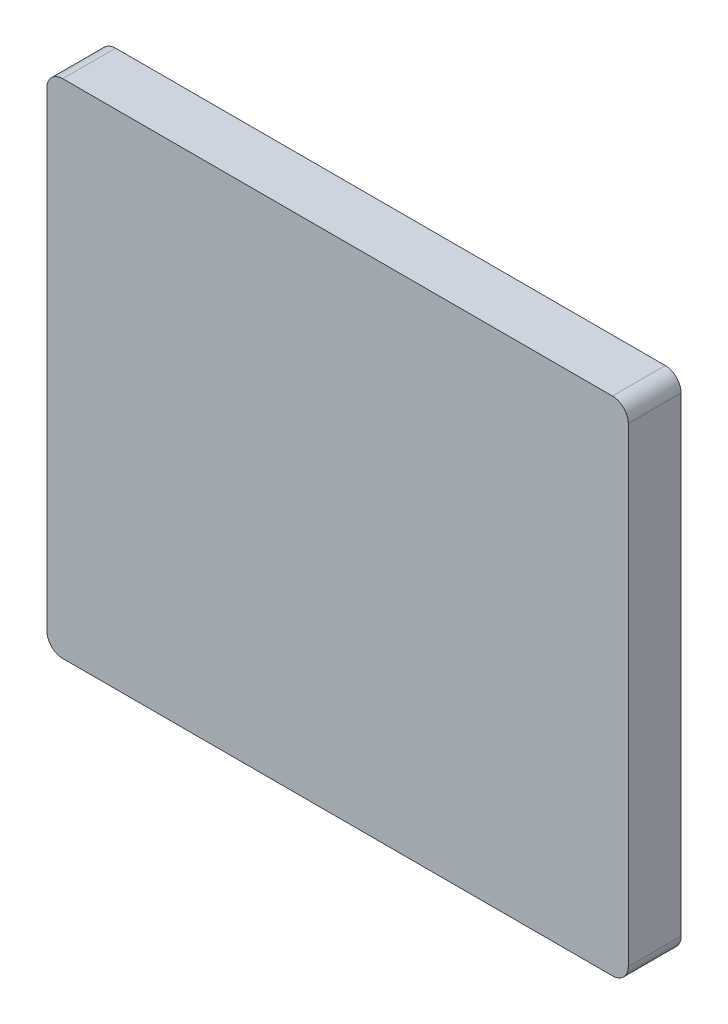
ISO-10303-21;
HEADER;
FILE_DESCRIPTION(('STEP AP214'),'2;1');
FILE_NAME('part.step','',(''),(''),'','','');
FILE_SCHEMA(('AUTOMOTIVE_DESIGN { 1 0 10303 214 1 1 1 1 }'));
ENDSEC;
DATA;
#1=APPLICATION_CONTEXT('core data for automotive mechanical design processes');
#2=APPLICATION_PROTOCOL_DEFINITION('international standard','automotive_design',2000,#1);
#3=PRODUCT_CONTEXT('',#1,'mechanical');
#4=PRODUCT('Part','Part','',(#3));
#5=PRODUCT_RELATED_PRODUCT_CATEGORY('part','',(#4));
#6=PRODUCT_DEFINITION_FORMATION('','',#4);
#7=PRODUCT_DEFINITION_CONTEXT('part definition',#1,'design');
#8=PRODUCT_DEFINITION('design','',#6,#7);
#9=PRODUCT_DEFINITION_SHAPE('','',#8);
#10=(LENGTH_UNIT() NAMED_UNIT(*) SI_UNIT(.MILLI.,.METRE.));
#11=(NAMED_UNIT(*) PLANE_ANGLE_UNIT() SI_UNIT($,.RADIAN.));
#12=(NAMED_UNIT(*) SI_UNIT($,.STERADIAN.) SOLID_ANGLE_UNIT());
#13=UNCERTAINTY_MEASURE_WITH_UNIT(LENGTH_MEASURE(1.E-05),#10,'distance_accuracy_value','');
#14=(GEOMETRIC_REPRESENTATION_CONTEXT(3) GLOBAL_UNCERTAINTY_ASSIGNED_CONTEXT((#13)) GLOBAL_UNIT_ASSIGNED_CONTEXT((#10,
#11,#12)) REPRESENTATION_CONTEXT('',''));
#15=CARTESIAN_POINT('',(0.,0.,0.));
#16=DIRECTION('',(0.,0.,1.));
#17=DIRECTION('',(1.,0.,0.));
#18=AXIS2_PLACEMENT_3D('',#15,#16,#17);
#19=CARTESIAN_POINT('',(-77.5181598062954,47.3849878934625,-10.));
#20=DIRECTION('',(-1.,0.,0.));
#21=DIRECTION('',(0.,0.,1.));
#22=AXIS2_PLACEMENT_3D('',#19,#20,#21);
#23=PLANE('',#22);
#24=DIRECTION('',(0.,-1.,0.));
#25=VECTOR('',#24,1.);
#26=CARTESIAN_POINT('',(-77.5181598062954,47.3849878934625,0.));
#27=LINE('',#26,#25);
#28=CARTESIAN_POINT('',(-77.5181598062954,44.3849878934625,0.));
#29=VERTEX_POINT('',#28);
#30=CARTESIAN_POINT('',(-77.5181598062954,-44.6150121065375,0.));
#31=VERTEX_POINT('',#30);
#32=EDGE_CURVE('E163',#29,#31,#27,.T.);
#33=ORIENTED_EDGE('',*,*,#32,.F.);
#34=DIRECTION('',(0.,0.,1.));
#35=VECTOR('',#34,1.);
#36=CARTESIAN_POINT('',(-77.5181598062954,44.3849878934625,-10.));
#37=LINE('',#36,#35);
#38=CARTESIAN_POINT('',(-77.5181598062954,44.3849878934625,-10.));
#39=VERTEX_POINT('',#38);
#40=EDGE_CURVE('E143',#29,#39,#37,.F.);
#41=ORIENTED_EDGE('',*,*,#40,.T.);
#42=DIRECTION('',(0.,-1.,0.));
#43=VECTOR('',#42,1.);
#44=CARTESIAN_POINT('',(-77.5181598062954,47.3849878934625,-10.));
#45=LINE('',#44,#43);
#46=CARTESIAN_POINT('',(-77.5181598062954,-44.6150121065375,-10.));
#47=VERTEX_POINT('',#46);
#48=EDGE_CURVE('E124',#39,#47,#45,.T.);
#49=ORIENTED_EDGE('',*,*,#48,.T.);
#50=DIRECTION('',(0.,0.,1.));
#51=VECTOR('',#50,1.);
#52=CARTESIAN_POINT('',(-77.5181598062954,-44.6150121065375,-10.));
#53=LINE('',#52,#51);
#54=EDGE_CURVE('E140',#47,#31,#53,.T.);
#55=ORIENTED_EDGE('',*,*,#54,.T.);
#56=EDGE_LOOP('',(#33,#41,#49,#55));
#57=FACE_BOUND('',#56,.T.);
#58=ADVANCED_FACE('F37',(#57),#23,.T.);
#59=CARTESIAN_POINT('',(-77.5181598062954,47.3849878934625,-10.));
#60=DIRECTION('',(0.,1.,0.));
#61=DIRECTION('',(0.,0.,1.));
#62=AXIS2_PLACEMENT_3D('',#59,#60,#61);
#63=PLANE('',#62);
#64=DIRECTION('',(-1.,0.,0.));
#65=VECTOR('',#64,1.);
#66=CARTESIAN_POINT('',(-77.5181598062954,47.3849878934625,-10.));
#67=LINE('',#66,#65);
#68=CARTESIAN_POINT('',(29.4818401937046,47.3849878934625,-10.));
#69=VERTEX_POINT('',#68);
#70=CARTESIAN_POINT('',(-74.5181598062954,47.3849878934625,-10.));
#71=VERTEX_POINT('',#70);
#72=EDGE_CURVE('E129',#69,#71,#67,.T.);
#73=ORIENTED_EDGE('',*,*,#72,.T.);
#74=DIRECTION('',(0.,0.,1.));
#75=VECTOR('',#74,1.);
#76=CARTESIAN_POINT('',(-74.5181598062954,47.3849878934625,-10.));
#77=LINE('',#76,#75);
#78=CARTESIAN_POINT('',(-74.5181598062954,47.3849878934625,0.));
#79=VERTEX_POINT('',#78);
#80=EDGE_CURVE('E123',#71,#79,#77,.T.);
#81=ORIENTED_EDGE('',*,*,#80,.T.);
#82=DIRECTION('',(-1.,0.,0.));
#83=VECTOR('',#82,1.);
#84=CARTESIAN_POINT('',(-77.5181598062954,47.3849878934625,0.));
#85=LINE('',#84,#83);
#86=CARTESIAN_POINT('',(29.4818401937046,47.3849878934625,0.));
#87=VERTEX_POINT('',#86);
#88=EDGE_CURVE('E106',#87,#79,#85,.T.);
#89=ORIENTED_EDGE('',*,*,#88,.F.);
#90=DIRECTION('',(0.,0.,1.));
#91=VECTOR('',#90,1.);
#92=CARTESIAN_POINT('',(29.4818401937046,47.3849878934625,-10.));
#93=LINE('',#92,#91);
#94=EDGE_CURVE('E120',#87,#69,#93,.F.);
#95=ORIENTED_EDGE('',*,*,#94,.T.);
#96=EDGE_LOOP('',(#73,#81,#89,#95));
#97=FACE_BOUND('',#96,.T.);
#98=ADVANCED_FACE('F119',(#97),#63,.T.);
#99=CARTESIAN_POINT('',(32.4818401937046,47.3849878934625,-10.));
#100=DIRECTION('',(1.,0.,0.));
#101=DIRECTION('',(0.,1.,0.));
#102=AXIS2_PLACEMENT_3D('',#99,#100,#101);
#103=PLANE('',#102);
#104=DIRECTION('',(0.,1.,0.));
#105=VECTOR('',#104,1.);
#106=CARTESIAN_POINT('',(32.4818401937046,47.3849878934625,-10.));
#107=LINE('',#106,#105);
#108=CARTESIAN_POINT('',(32.4818401937046,-44.6150121065375,-10.));
#109=VERTEX_POINT('',#108);
#110=CARTESIAN_POINT('',(32.4818401937046,44.3849878934625,-10.));
#111=VERTEX_POINT('',#110);
#112=EDGE_CURVE('E133',#109,#111,#107,.T.);
#113=ORIENTED_EDGE('',*,*,#112,.T.);
#114=DIRECTION('',(0.,0.,1.));
#115=VECTOR('',#114,1.);
#116=CARTESIAN_POINT('',(32.4818401937046,44.3849878934625,-10.));
#117=LINE('',#116,#115);
#118=CARTESIAN_POINT('',(32.4818401937046,44.3849878934625,0.));
#119=VERTEX_POINT('',#118);
#120=EDGE_CURVE('E153',#111,#119,#117,.T.);
#121=ORIENTED_EDGE('',*,*,#120,.T.);
#122=DIRECTION('',(0.,1.,0.));
#123=VECTOR('',#122,1.);
#124=CARTESIAN_POINT('',(32.4818401937046,47.3849878934625,0.));
#125=LINE('',#124,#123);
#126=CARTESIAN_POINT('',(32.4818401937046,-44.6150121065375,0.));
#127=VERTEX_POINT('',#126);
#128=EDGE_CURVE('E108',#127,#119,#125,.T.);
#129=ORIENTED_EDGE('',*,*,#128,.F.);
#130=DIRECTION('',(0.,0.,1.));
#131=VECTOR('',#130,1.);
#132=CARTESIAN_POINT('',(32.4818401937046,-44.6150121065375,-10.));
#133=LINE('',#132,#131);
#134=EDGE_CURVE('E151',#127,#109,#133,.F.);
#135=ORIENTED_EDGE('',*,*,#134,.T.);
#136=EDGE_LOOP('',(#113,#121,#129,#135));
#137=FACE_BOUND('',#136,.T.);
#138=ADVANCED_FACE('F156',(#137),#103,.T.);
#139=CARTESIAN_POINT('',(-77.5181598062954,-47.6150121065375,-10.));
#140=DIRECTION('',(0.,-1.,0.));
#141=DIRECTION('',(1.,0.,0.));
#142=AXIS2_PLACEMENT_3D('',#139,#140,#141);
#143=PLANE('',#142);
#144=DIRECTION('',(1.,0.,0.));
#145=VECTOR('',#144,1.);
#146=CARTESIAN_POINT('',(-77.5181598062954,-47.6150121065375,-10.));
#147=LINE('',#146,#145);
#148=CARTESIAN_POINT('',(-74.5181598062954,-47.6150121065375,-10.));
#149=VERTEX_POINT('',#148);
#150=CARTESIAN_POINT('',(29.4818401937046,-47.6150121065375,-10.));
#151=VERTEX_POINT('',#150);
#152=EDGE_CURVE('E158',#149,#151,#147,.T.);
#153=ORIENTED_EDGE('',*,*,#152,.T.);
#154=DIRECTION('',(0.,0.,1.));
#155=VECTOR('',#154,1.);
#156=CARTESIAN_POINT('',(29.4818401937046,-47.6150121065375,-10.));
#157=LINE('',#156,#155);
#158=CARTESIAN_POINT('',(29.4818401937046,-47.6150121065375,0.));
#159=VERTEX_POINT('',#158);
#160=EDGE_CURVE('E11',#151,#159,#157,.T.);
#161=ORIENTED_EDGE('',*,*,#160,.T.);
#162=DIRECTION('',(1.,0.,0.));
#163=VECTOR('',#162,1.);
#164=CARTESIAN_POINT('',(-77.5181598062954,-47.6150121065375,0.));
#165=LINE('',#164,#163);
#166=CARTESIAN_POINT('',(-74.5181598062954,-47.6150121065375,0.));
#167=VERTEX_POINT('',#166);
#168=EDGE_CURVE('E166',#167,#159,#165,.T.);
#169=ORIENTED_EDGE('',*,*,#168,.F.);
#170=DIRECTION('',(0.,0.,1.));
#171=VECTOR('',#170,1.);
#172=CARTESIAN_POINT('',(-74.5181598062954,-47.6150121065375,-10.));
#173=LINE('',#172,#171);
#174=EDGE_CURVE('E45',#167,#149,#173,.F.);
#175=ORIENTED_EDGE('',*,*,#174,.T.);
#176=EDGE_LOOP('',(#153,#161,#169,#175));
#177=FACE_BOUND('',#176,.T.);
#178=ADVANCED_FACE('F168',(#177),#143,.T.);
#179=CARTESIAN_POINT('',(0.,0.,-10.));
#180=DIRECTION('',(0.,0.,1.));
#181=DIRECTION('',(1.,0.,0.));
#182=AXIS2_PLACEMENT_3D('',#179,#180,#181);
#183=PLANE('',#182);
#184=ORIENTED_EDGE('',*,*,#48,.F.);
#185=CARTESIAN_POINT('',(-74.5181598062954,44.3849878934625,-10.));
#186=DIRECTION('',(0.,0.,1.));
#187=DIRECTION('',(1.,0.,0.));
#188=AXIS2_PLACEMENT_3D('',#185,#186,#187);
#189=CIRCLE('',#188,3.);
#190=EDGE_CURVE('E149',#39,#71,#189,.F.);
#191=ORIENTED_EDGE('',*,*,#190,.T.);
#192=ORIENTED_EDGE('',*,*,#72,.F.);
#193=CARTESIAN_POINT('',(29.4818401937046,44.3849878934625,-10.));
#194=DIRECTION('',(0.,0.,1.));
#195=DIRECTION('',(1.,0.,0.));
#196=AXIS2_PLACEMENT_3D('',#193,#194,#195);
#197=CIRCLE('',#196,3.);
#198=EDGE_CURVE('E128',#69,#111,#197,.F.);
#199=ORIENTED_EDGE('',*,*,#198,.T.);
#200=ORIENTED_EDGE('',*,*,#112,.F.);
#201=CARTESIAN_POINT('',(29.4818401937046,-44.6150121065375,-10.));
#202=DIRECTION('',(0.,0.,1.));
#203=DIRECTION('',(1.,0.,0.));
#204=AXIS2_PLACEMENT_3D('',#201,#202,#203);
#205=CIRCLE('',#204,3.);
#206=EDGE_CURVE('E52',#109,#151,#205,.F.);
#207=ORIENTED_EDGE('',*,*,#206,.T.);
#208=ORIENTED_EDGE('',*,*,#152,.F.);
#209=CARTESIAN_POINT('',(-74.5181598062954,-44.6150121065375,-10.));
#210=DIRECTION('',(0.,0.,1.));
#211=DIRECTION('',(1.,0.,0.));
#212=AXIS2_PLACEMENT_3D('',#209,#210,#211);
#213=CIRCLE('',#212,3.);
#214=EDGE_CURVE('E145',#149,#47,#213,.F.);
#215=ORIENTED_EDGE('',*,*,#214,.T.);
#216=EDGE_LOOP('',(#184,#191,#192,#199,#200,#207,#208,#215));
#217=FACE_BOUND('',#216,.T.);
#218=ADVANCED_FACE('F175',(#217),#183,.F.);
#219=CARTESIAN_POINT('',(0.,0.,0.));
#220=DIRECTION('',(0.,0.,1.));
#221=DIRECTION('',(1.,0.,0.));
#222=AXIS2_PLACEMENT_3D('',#219,#220,#221);
#223=PLANE('',#222);
#224=ORIENTED_EDGE('',*,*,#88,.T.);
#225=CARTESIAN_POINT('',(-74.5181598062954,44.3849878934625,0.));
#226=DIRECTION('',(0.,0.,1.));
#227=DIRECTION('',(1.,0.,0.));
#228=AXIS2_PLACEMENT_3D('',#225,#226,#227);
#229=CIRCLE('',#228,3.);
#230=EDGE_CURVE('E113',#79,#29,#229,.T.);
#231=ORIENTED_EDGE('',*,*,#230,.T.);
#232=ORIENTED_EDGE('',*,*,#32,.T.);
#233=CARTESIAN_POINT('',(-74.5181598062954,-44.6150121065375,0.));
#234=DIRECTION('',(0.,0.,1.));
#235=DIRECTION('',(1.,0.,0.));
#236=AXIS2_PLACEMENT_3D('',#233,#234,#235);
#237=CIRCLE('',#236,3.);
#238=EDGE_CURVE('E131',#31,#167,#237,.T.);
#239=ORIENTED_EDGE('',*,*,#238,.T.);
#240=ORIENTED_EDGE('',*,*,#168,.T.);
#241=CARTESIAN_POINT('',(29.4818401937046,-44.6150121065375,0.));
#242=DIRECTION('',(0.,0.,1.));
#243=DIRECTION('',(1.,0.,0.));
#244=AXIS2_PLACEMENT_3D('',#241,#242,#243);
#245=CIRCLE('',#244,3.);
#246=EDGE_CURVE('E114',#159,#127,#245,.T.);
#247=ORIENTED_EDGE('',*,*,#246,.T.);
#248=ORIENTED_EDGE('',*,*,#128,.T.);
#249=CARTESIAN_POINT('',(29.4818401937046,44.3849878934625,0.));
#250=DIRECTION('',(0.,0.,1.));
#251=DIRECTION('',(1.,0.,0.));
#252=AXIS2_PLACEMENT_3D('',#249,#250,#251);
#253=CIRCLE('',#252,3.);
#254=EDGE_CURVE('E103',#119,#87,#253,.T.);
#255=ORIENTED_EDGE('',*,*,#254,.T.);
#256=EDGE_LOOP('',(#224,#231,#232,#239,#240,#247,#248,#255));
#257=FACE_BOUND('',#256,.T.);
#258=ADVANCED_FACE('F105',(#257),#223,.T.);
#259=CARTESIAN_POINT('',(-74.5181598062954,44.3849878934625,-10.));
#260=DIRECTION('',(0.,0.,1.));
#261=DIRECTION('',(1.,0.,0.));
#262=AXIS2_PLACEMENT_3D('',#259,#260,#261);
#263=CYLINDRICAL_SURFACE('',#262,3.);
#264=ORIENTED_EDGE('',*,*,#190,.F.);
#265=ORIENTED_EDGE('',*,*,#40,.F.);
#266=ORIENTED_EDGE('',*,*,#230,.F.);
#267=ORIENTED_EDGE('',*,*,#80,.F.);
#268=EDGE_LOOP('',(#264,#265,#266,#267));
#269=FACE_BOUND('',#268,.T.);
#270=ADVANCED_FACE('F181',(#269),#263,.T.);
#271=CARTESIAN_POINT('',(29.4818401937046,44.3849878934625,-10.));
#272=DIRECTION('',(0.,0.,1.));
#273=DIRECTION('',(1.,0.,0.));
#274=AXIS2_PLACEMENT_3D('',#271,#272,#273);
#275=CYLINDRICAL_SURFACE('',#274,3.);
#276=ORIENTED_EDGE('',*,*,#198,.F.);
#277=ORIENTED_EDGE('',*,*,#94,.F.);
#278=ORIENTED_EDGE('',*,*,#254,.F.);
#279=ORIENTED_EDGE('',*,*,#120,.F.);
#280=EDGE_LOOP('',(#276,#277,#278,#279));
#281=FACE_BOUND('',#280,.T.);
#282=ADVANCED_FACE('F127',(#281),#275,.T.);
#283=CARTESIAN_POINT('',(29.4818401937046,-44.6150121065375,-10.));
#284=DIRECTION('',(0.,0.,1.));
#285=DIRECTION('',(1.,0.,0.));
#286=AXIS2_PLACEMENT_3D('',#283,#284,#285);
#287=CYLINDRICAL_SURFACE('',#286,3.);
#288=ORIENTED_EDGE('',*,*,#206,.F.);
#289=ORIENTED_EDGE('',*,*,#134,.F.);
#290=ORIENTED_EDGE('',*,*,#246,.F.);
#291=ORIENTED_EDGE('',*,*,#160,.F.);
#292=EDGE_LOOP('',(#288,#289,#290,#291));
#293=FACE_BOUND('',#292,.T.);
#294=ADVANCED_FACE('F188',(#293),#287,.T.);
#295=CARTESIAN_POINT('',(-74.5181598062954,-44.6150121065375,-10.));
#296=DIRECTION('',(0.,0.,1.));
#297=DIRECTION('',(1.,0.,0.));
#298=AXIS2_PLACEMENT_3D('',#295,#296,#297);
#299=CYLINDRICAL_SURFACE('',#298,3.);
#300=ORIENTED_EDGE('',*,*,#214,.F.);
#301=ORIENTED_EDGE('',*,*,#174,.F.);
#302=ORIENTED_EDGE('',*,*,#238,.F.);
#303=ORIENTED_EDGE('',*,*,#54,.F.);
#304=EDGE_LOOP('',(#300,#301,#302,#303));
#305=FACE_BOUND('',#304,.T.);
#306=ADVANCED_FACE('F39',(#305),#299,.T.);
#307=CLOSED_SHELL('',(#58,#98,#138,#178,#218,#258,#270,#282,#294,#306));
#308=MANIFOLD_SOLID_BREP('B2',#307);
#309=ADVANCED_BREP_SHAPE_REPRESENTATION('',(#18,#308),#14);
#310=SHAPE_DEFINITION_REPRESENTATION(#9,#309);
ENDSEC;
END-ISO-10303-21;
